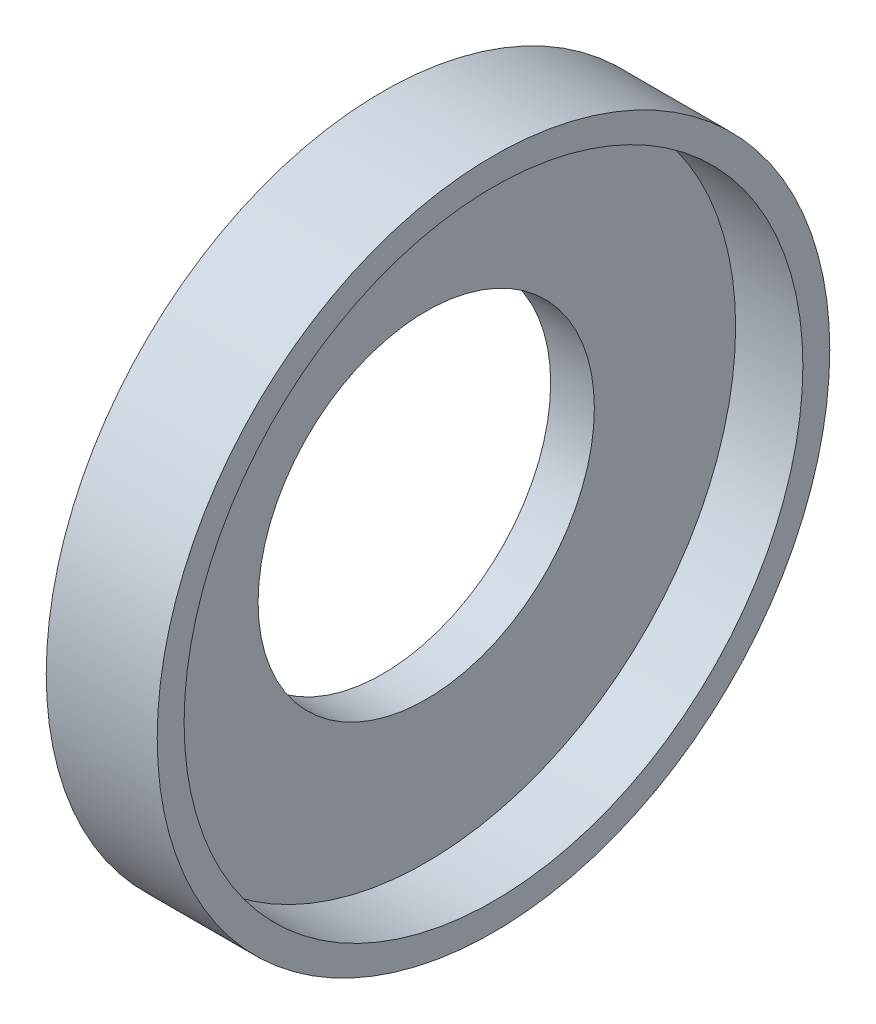
ISO-10303-21;
HEADER;
FILE_DESCRIPTION(('STEP AP214'),'2;1');
FILE_NAME('part.step','',(''),(''),'','','');
FILE_SCHEMA(('AUTOMOTIVE_DESIGN { 1 0 10303 214 1 1 1 1 }'));
ENDSEC;
DATA;
#1=APPLICATION_CONTEXT('core data for automotive mechanical design processes');
#2=APPLICATION_PROTOCOL_DEFINITION('international standard','automotive_design',2000,#1);
#3=PRODUCT_CONTEXT('',#1,'mechanical');
#4=PRODUCT('Part','Part','',(#3));
#5=PRODUCT_RELATED_PRODUCT_CATEGORY('part','',(#4));
#6=PRODUCT_DEFINITION_FORMATION('','',#4);
#7=PRODUCT_DEFINITION_CONTEXT('part definition',#1,'design');
#8=PRODUCT_DEFINITION('design','',#6,#7);
#9=PRODUCT_DEFINITION_SHAPE('','',#8);
#10=(LENGTH_UNIT() NAMED_UNIT(*) SI_UNIT(.MILLI.,.METRE.));
#11=(NAMED_UNIT(*) PLANE_ANGLE_UNIT() SI_UNIT($,.RADIAN.));
#12=(NAMED_UNIT(*) SI_UNIT($,.STERADIAN.) SOLID_ANGLE_UNIT());
#13=UNCERTAINTY_MEASURE_WITH_UNIT(LENGTH_MEASURE(1.E-05),#10,'distance_accuracy_value','');
#14=(GEOMETRIC_REPRESENTATION_CONTEXT(3) GLOBAL_UNCERTAINTY_ASSIGNED_CONTEXT((#13)) GLOBAL_UNIT_ASSIGNED_CONTEXT((#10,
#11,#12)) REPRESENTATION_CONTEXT('',''));
#15=CARTESIAN_POINT('',(0.,0.,0.));
#16=DIRECTION('',(0.,0.,1.));
#17=DIRECTION('',(1.,0.,0.));
#18=AXIS2_PLACEMENT_3D('',#15,#16,#17);
#19=CARTESIAN_POINT('',(20.03,0.,0.));
#20=DIRECTION('',(1.,0.,0.));
#21=DIRECTION('',(0.,0.,-1.));
#22=AXIS2_PLACEMENT_3D('',#19,#20,#21);
#23=CYLINDRICAL_SURFACE('',#22,4.6);
#24=CARTESIAN_POINT('',(19.53,0.,0.));
#25=DIRECTION('',(1.,0.,0.));
#26=DIRECTION('',(0.,0.,-1.));
#27=AXIS2_PLACEMENT_3D('',#24,#25,#26);
#28=CIRCLE('',#27,4.6);
#29=CARTESIAN_POINT('',(19.53,0.,-4.6));
#30=VERTEX_POINT('',#29);
#31=EDGE_CURVE('E34',#30,#30,#28,.F.);
#32=ORIENTED_EDGE('',*,*,#31,.T.);
#33=EDGE_LOOP('',(#32));
#34=FACE_BOUND('',#33,.T.);
#35=CARTESIAN_POINT('',(20.53,0.,0.));
#36=DIRECTION('',(1.,0.,0.));
#37=DIRECTION('',(0.,0.,-1.));
#38=AXIS2_PLACEMENT_3D('',#35,#36,#37);
#39=CIRCLE('',#38,4.6);
#40=CARTESIAN_POINT('',(20.53,0.,-4.6));
#41=VERTEX_POINT('',#40);
#42=EDGE_CURVE('E18',#41,#41,#39,.F.);
#43=ORIENTED_EDGE('',*,*,#42,.F.);
#44=EDGE_LOOP('',(#43));
#45=FACE_BOUND('',#44,.T.);
#46=ADVANCED_FACE('F15',(#34,#45),#23,.F.);
#47=CARTESIAN_POINT('',(20.53,0.,3.75));
#48=DIRECTION('',(1.,0.,0.));
#49=DIRECTION('',(0.,0.,-1.));
#50=AXIS2_PLACEMENT_3D('',#47,#48,#49);
#51=PLANE('',#50);
#52=CARTESIAN_POINT('',(20.53,0.,0.));
#53=DIRECTION('',(1.,0.,0.));
#54=DIRECTION('',(0.,0.,-1.));
#55=AXIS2_PLACEMENT_3D('',#52,#53,#54);
#56=CIRCLE('',#55,5.);
#57=CARTESIAN_POINT('',(20.53,0.,-5.));
#58=VERTEX_POINT('',#57);
#59=EDGE_CURVE('E32',#58,#58,#56,.F.);
#60=ORIENTED_EDGE('',*,*,#59,.F.);
#61=EDGE_LOOP('',(#60));
#62=FACE_BOUND('',#61,.T.);
#63=ORIENTED_EDGE('',*,*,#42,.T.);
#64=EDGE_LOOP('',(#63));
#65=FACE_BOUND('',#64,.T.);
#66=ADVANCED_FACE('F41',(#62,#65),#51,.T.);
#67=CARTESIAN_POINT('',(19.53,0.,0.));
#68=DIRECTION('',(-1.,0.,0.));
#69=DIRECTION('',(0.,0.,1.));
#70=AXIS2_PLACEMENT_3D('',#67,#68,#69);
#71=PLANE('',#70);
#72=ORIENTED_EDGE('',*,*,#31,.F.);
#73=EDGE_LOOP('',(#72));
#74=FACE_BOUND('',#73,.T.);
#75=CARTESIAN_POINT('',(19.53,0.,0.));
#76=DIRECTION('',(1.,0.,0.));
#77=DIRECTION('',(0.,0.,-1.));
#78=AXIS2_PLACEMENT_3D('',#75,#76,#77);
#79=CIRCLE('',#78,2.5);
#80=CARTESIAN_POINT('',(19.53,0.,-2.5));
#81=VERTEX_POINT('',#80);
#82=EDGE_CURVE('E27',#81,#81,#79,.F.);
#83=ORIENTED_EDGE('',*,*,#82,.T.);
#84=EDGE_LOOP('',(#83));
#85=FACE_BOUND('',#84,.T.);
#86=ADVANCED_FACE('F48',(#74,#85),#71,.F.);
#87=CARTESIAN_POINT('',(19.705,0.,0.));
#88=DIRECTION('',(1.,0.,0.));
#89=DIRECTION('',(0.,0.,-1.));
#90=AXIS2_PLACEMENT_3D('',#87,#88,#89);
#91=CYLINDRICAL_SURFACE('',#90,5.);
#92=ORIENTED_EDGE('',*,*,#59,.T.);
#93=EDGE_LOOP('',(#92));
#94=FACE_BOUND('',#93,.T.);
#95=CARTESIAN_POINT('',(18.88,0.,0.));
#96=DIRECTION('',(1.,0.,0.));
#97=DIRECTION('',(0.,0.,-1.));
#98=AXIS2_PLACEMENT_3D('',#95,#96,#97);
#99=CIRCLE('',#98,5.);
#100=CARTESIAN_POINT('',(18.88,0.,-5.));
#101=VERTEX_POINT('',#100);
#102=EDGE_CURVE('E22',#101,#101,#99,.F.);
#103=ORIENTED_EDGE('',*,*,#102,.F.);
#104=EDGE_LOOP('',(#103));
#105=FACE_BOUND('',#104,.T.);
#106=ADVANCED_FACE('F57',(#94,#105),#91,.T.);
#107=CARTESIAN_POINT('',(19.705,0.,0.));
#108=DIRECTION('',(1.,0.,0.));
#109=DIRECTION('',(0.,0.,-1.));
#110=AXIS2_PLACEMENT_3D('',#107,#108,#109);
#111=CYLINDRICAL_SURFACE('',#110,2.5);
#112=CARTESIAN_POINT('',(18.88,0.,0.));
#113=DIRECTION('',(1.,0.,0.));
#114=DIRECTION('',(0.,0.,-1.));
#115=AXIS2_PLACEMENT_3D('',#112,#113,#114);
#116=CIRCLE('',#115,2.5);
#117=CARTESIAN_POINT('',(18.88,0.,-2.5));
#118=VERTEX_POINT('',#117);
#119=EDGE_CURVE('E10',#118,#118,#116,.T.);
#120=ORIENTED_EDGE('',*,*,#119,.F.);
#121=EDGE_LOOP('',(#120));
#122=FACE_BOUND('',#121,.T.);
#123=ORIENTED_EDGE('',*,*,#82,.F.);
#124=EDGE_LOOP('',(#123));
#125=FACE_BOUND('',#124,.T.);
#126=ADVANCED_FACE('F52',(#122,#125),#111,.F.);
#127=CARTESIAN_POINT('',(18.88,0.,3.75));
#128=DIRECTION('',(-1.,0.,0.));
#129=DIRECTION('',(0.,0.,1.));
#130=AXIS2_PLACEMENT_3D('',#127,#128,#129);
#131=PLANE('',#130);
#132=ORIENTED_EDGE('',*,*,#119,.T.);
#133=EDGE_LOOP('',(#132));
#134=FACE_BOUND('',#133,.T.);
#135=ORIENTED_EDGE('',*,*,#102,.T.);
#136=EDGE_LOOP('',(#135));
#137=FACE_BOUND('',#136,.T.);
#138=ADVANCED_FACE('F50',(#134,#137),#131,.T.);
#139=CLOSED_SHELL('',(#46,#66,#86,#106,#126,#138));
#140=MANIFOLD_SOLID_BREP('B1',#139);
#141=ADVANCED_BREP_SHAPE_REPRESENTATION('',(#18,#140),#14);
#142=SHAPE_DEFINITION_REPRESENTATION(#9,#141);
ENDSEC;
END-ISO-10303-21;
